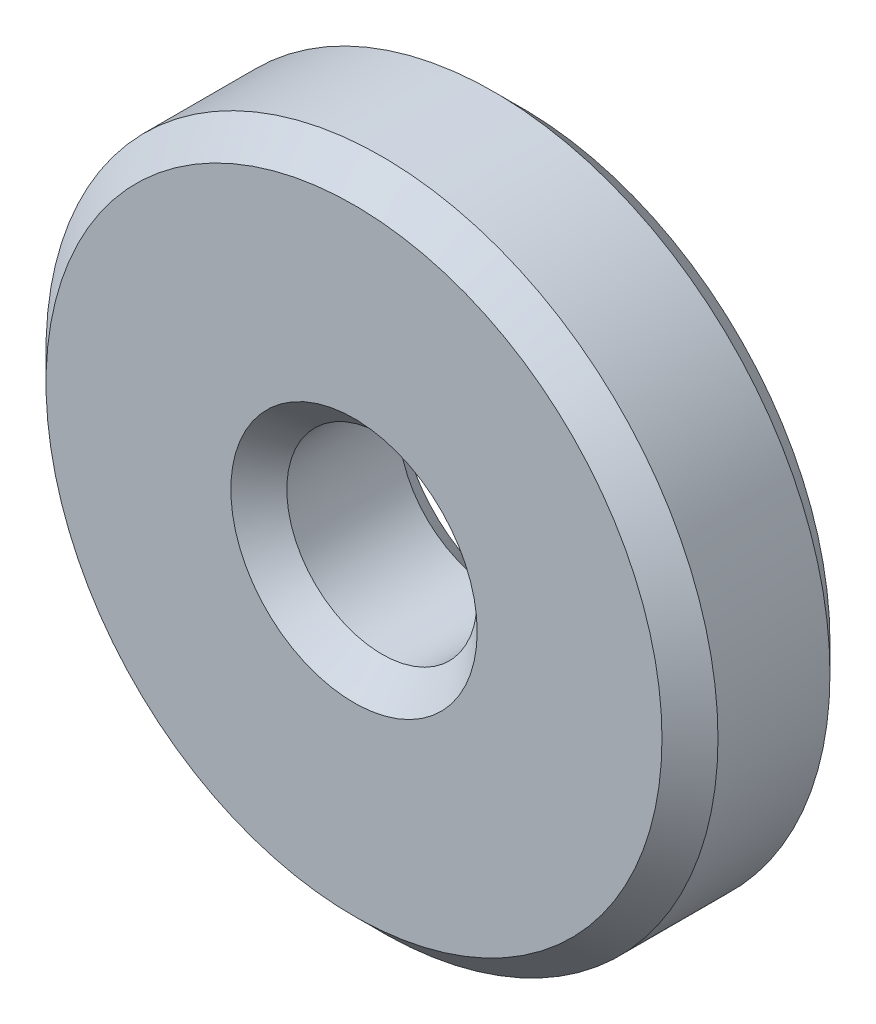
ISO-10303-21;
HEADER;
FILE_DESCRIPTION(('STEP AP214'),'2;1');
FILE_NAME('part.step','',(''),(''),'','','');
FILE_SCHEMA(('AUTOMOTIVE_DESIGN { 1 0 10303 214 1 1 1 1 }'));
ENDSEC;
DATA;
#1=APPLICATION_CONTEXT('core data for automotive mechanical design processes');
#2=APPLICATION_PROTOCOL_DEFINITION('international standard','automotive_design',2000,#1);
#3=PRODUCT_CONTEXT('',#1,'mechanical');
#4=PRODUCT('Part','Part','',(#3));
#5=PRODUCT_RELATED_PRODUCT_CATEGORY('part','',(#4));
#6=PRODUCT_DEFINITION_FORMATION('','',#4);
#7=PRODUCT_DEFINITION_CONTEXT('part definition',#1,'design');
#8=PRODUCT_DEFINITION('design','',#6,#7);
#9=PRODUCT_DEFINITION_SHAPE('','',#8);
#10=(LENGTH_UNIT() NAMED_UNIT(*) SI_UNIT(.MILLI.,.METRE.));
#11=(NAMED_UNIT(*) PLANE_ANGLE_UNIT() SI_UNIT($,.RADIAN.));
#12=(NAMED_UNIT(*) SI_UNIT($,.STERADIAN.) SOLID_ANGLE_UNIT());
#13=UNCERTAINTY_MEASURE_WITH_UNIT(LENGTH_MEASURE(1.E-05),#10,'distance_accuracy_value','');
#14=(GEOMETRIC_REPRESENTATION_CONTEXT(3) GLOBAL_UNCERTAINTY_ASSIGNED_CONTEXT((#13)) GLOBAL_UNIT_ASSIGNED_CONTEXT((#10,
#11,#12)) REPRESENTATION_CONTEXT('',''));
#15=CARTESIAN_POINT('',(0.,0.,0.));
#16=DIRECTION('',(0.,0.,1.));
#17=DIRECTION('',(1.,0.,0.));
#18=AXIS2_PLACEMENT_3D('',#15,#16,#17);
#19=CARTESIAN_POINT('',(0.,0.,3.));
#20=DIRECTION('',(0.,0.,1.));
#21=DIRECTION('',(1.,0.,0.));
#22=AXIS2_PLACEMENT_3D('',#19,#20,#21);
#23=PLANE('',#22);
#24=CARTESIAN_POINT('',(0.,0.,3.));
#25=DIRECTION('',(0.,0.,1.));
#26=DIRECTION('',(1.,0.,0.));
#27=AXIS2_PLACEMENT_3D('',#24,#25,#26);
#28=CIRCLE('',#27,2.2);
#29=CARTESIAN_POINT('',(2.2,0.,3.));
#30=VERTEX_POINT('',#29);
#31=EDGE_CURVE('E10',#30,#30,#28,.F.);
#32=ORIENTED_EDGE('',*,*,#31,.T.);
#33=EDGE_LOOP('',(#32));
#34=FACE_BOUND('',#33,.T.);
#35=CARTESIAN_POINT('',(0.,0.,3.));
#36=DIRECTION('',(0.,0.,1.));
#37=DIRECTION('',(1.,0.,0.));
#38=AXIS2_PLACEMENT_3D('',#35,#36,#37);
#39=CIRCLE('',#38,5.5);
#40=CARTESIAN_POINT('',(5.5,0.,3.));
#41=VERTEX_POINT('',#40);
#42=EDGE_CURVE('E37',#41,#41,#39,.T.);
#43=ORIENTED_EDGE('',*,*,#42,.T.);
#44=EDGE_LOOP('',(#43));
#45=FACE_BOUND('',#44,.T.);
#46=ADVANCED_FACE('F30',(#34,#45),#23,.T.);
#47=CARTESIAN_POINT('',(0.,0.,0.));
#48=DIRECTION('',(0.,0.,1.));
#49=DIRECTION('',(1.,0.,0.));
#50=AXIS2_PLACEMENT_3D('',#47,#48,#49);
#51=PLANE('',#50);
#52=CARTESIAN_POINT('',(0.,0.,0.));
#53=DIRECTION('',(0.,0.,1.));
#54=DIRECTION('',(1.,0.,0.));
#55=AXIS2_PLACEMENT_3D('',#52,#53,#54);
#56=CIRCLE('',#55,2.2);
#57=CARTESIAN_POINT('',(2.2,0.,0.));
#58=VERTEX_POINT('',#57);
#59=EDGE_CURVE('E56',#58,#58,#56,.T.);
#60=ORIENTED_EDGE('',*,*,#59,.T.);
#61=EDGE_LOOP('',(#60));
#62=FACE_BOUND('',#61,.T.);
#63=CARTESIAN_POINT('',(0.,0.,0.));
#64=DIRECTION('',(0.,0.,1.));
#65=DIRECTION('',(1.,0.,0.));
#66=AXIS2_PLACEMENT_3D('',#63,#64,#65);
#67=CIRCLE('',#66,5.5);
#68=CARTESIAN_POINT('',(5.5,0.,0.));
#69=VERTEX_POINT('',#68);
#70=EDGE_CURVE('E59',#69,#69,#67,.F.);
#71=ORIENTED_EDGE('',*,*,#70,.T.);
#72=EDGE_LOOP('',(#71));
#73=FACE_BOUND('',#72,.T.);
#74=ADVANCED_FACE('F63',(#62,#73),#51,.F.);
#75=CARTESIAN_POINT('',(0.,0.,3.));
#76=DIRECTION('',(0.,0.,-1.));
#77=DIRECTION('',(-1.,0.,0.));
#78=AXIS2_PLACEMENT_3D('',#75,#76,#77);
#79=CYLINDRICAL_SURFACE('',#78,6.);
#80=CARTESIAN_POINT('',(0.,0.,0.499999999999998));
#81=DIRECTION('',(0.,0.,1.));
#82=DIRECTION('',(1.,0.,0.));
#83=AXIS2_PLACEMENT_3D('',#80,#81,#82);
#84=CIRCLE('',#83,6.);
#85=CARTESIAN_POINT('',(6.,0.,0.499999999999998));
#86=VERTEX_POINT('',#85);
#87=EDGE_CURVE('E41',#86,#86,#84,.T.);
#88=ORIENTED_EDGE('',*,*,#87,.T.);
#89=EDGE_LOOP('',(#88));
#90=FACE_BOUND('',#89,.T.);
#91=CARTESIAN_POINT('',(0.,0.,2.5));
#92=DIRECTION('',(0.,0.,1.));
#93=DIRECTION('',(1.,0.,0.));
#94=AXIS2_PLACEMENT_3D('',#91,#92,#93);
#95=CIRCLE('',#94,6.);
#96=CARTESIAN_POINT('',(6.,0.,2.5));
#97=VERTEX_POINT('',#96);
#98=EDGE_CURVE('E45',#97,#97,#95,.F.);
#99=ORIENTED_EDGE('',*,*,#98,.T.);
#100=EDGE_LOOP('',(#99));
#101=FACE_BOUND('',#100,.T.);
#102=ADVANCED_FACE('F73',(#90,#101),#79,.T.);
#103=CARTESIAN_POINT('',(0.,0.,3.));
#104=DIRECTION('',(0.,0.,-1.));
#105=DIRECTION('',(-1.,0.,0.));
#106=AXIS2_PLACEMENT_3D('',#103,#104,#105);
#107=CYLINDRICAL_SURFACE('',#106,1.7);
#108=CARTESIAN_POINT('',(0.,0.,0.500000000000002));
#109=DIRECTION('',(0.,0.,1.));
#110=DIRECTION('',(1.,0.,0.));
#111=AXIS2_PLACEMENT_3D('',#108,#109,#110);
#112=CIRCLE('',#111,1.7);
#113=CARTESIAN_POINT('',(1.7,0.,0.500000000000002));
#114=VERTEX_POINT('',#113);
#115=EDGE_CURVE('E50',#114,#114,#112,.F.);
#116=ORIENTED_EDGE('',*,*,#115,.T.);
#117=EDGE_LOOP('',(#116));
#118=FACE_BOUND('',#117,.T.);
#119=CARTESIAN_POINT('',(0.,0.,2.5));
#120=DIRECTION('',(0.,0.,1.));
#121=DIRECTION('',(1.,0.,0.));
#122=AXIS2_PLACEMENT_3D('',#119,#120,#121);
#123=CIRCLE('',#122,1.7);
#124=CARTESIAN_POINT('',(1.7,0.,2.5));
#125=VERTEX_POINT('',#124);
#126=EDGE_CURVE('E53',#125,#125,#123,.T.);
#127=ORIENTED_EDGE('',*,*,#126,.T.);
#128=EDGE_LOOP('',(#127));
#129=FACE_BOUND('',#128,.T.);
#130=ADVANCED_FACE('F76',(#118,#129),#107,.F.);
#131=CARTESIAN_POINT('',(0.,0.,0.));
#132=DIRECTION('',(0.,0.,-1.));
#133=DIRECTION('',(-1.,0.,0.));
#134=AXIS2_PLACEMENT_3D('',#131,#132,#133);
#135=CONICAL_SURFACE('',#134,2.2,0.785398163397446);
#136=ORIENTED_EDGE('',*,*,#115,.F.);
#137=EDGE_LOOP('',(#136));
#138=FACE_BOUND('',#137,.T.);
#139=ORIENTED_EDGE('',*,*,#59,.F.);
#140=EDGE_LOOP('',(#139));
#141=FACE_BOUND('',#140,.T.);
#142=ADVANCED_FACE('F69',(#138,#141),#135,.F.);
#143=CARTESIAN_POINT('',(0.,0.,0.499999999999998));
#144=DIRECTION('',(0.,0.,1.));
#145=DIRECTION('',(1.,0.,0.));
#146=AXIS2_PLACEMENT_3D('',#143,#144,#145);
#147=CONICAL_SURFACE('',#146,6.,0.785398163397451);
#148=ORIENTED_EDGE('',*,*,#70,.F.);
#149=EDGE_LOOP('',(#148));
#150=FACE_BOUND('',#149,.T.);
#151=ORIENTED_EDGE('',*,*,#87,.F.);
#152=EDGE_LOOP('',(#151));
#153=FACE_BOUND('',#152,.T.);
#154=ADVANCED_FACE('F65',(#150,#153),#147,.T.);
#155=CARTESIAN_POINT('',(0.,0.,2.5));
#156=DIRECTION('',(0.,0.,1.));
#157=DIRECTION('',(1.,0.,0.));
#158=AXIS2_PLACEMENT_3D('',#155,#156,#157);
#159=CONICAL_SURFACE('',#158,1.7,0.785398163397451);
#160=ORIENTED_EDGE('',*,*,#31,.F.);
#161=EDGE_LOOP('',(#160));
#162=FACE_BOUND('',#161,.T.);
#163=ORIENTED_EDGE('',*,*,#126,.F.);
#164=EDGE_LOOP('',(#163));
#165=FACE_BOUND('',#164,.T.);
#166=ADVANCED_FACE('F68',(#162,#165),#159,.F.);
#167=CARTESIAN_POINT('',(0.,0.,3.));
#168=DIRECTION('',(0.,0.,-1.));
#169=DIRECTION('',(-1.,0.,0.));
#170=AXIS2_PLACEMENT_3D('',#167,#168,#169);
#171=CONICAL_SURFACE('',#170,5.5,0.785398163397447);
#172=ORIENTED_EDGE('',*,*,#98,.F.);
#173=EDGE_LOOP('',(#172));
#174=FACE_BOUND('',#173,.T.);
#175=ORIENTED_EDGE('',*,*,#42,.F.);
#176=EDGE_LOOP('',(#175));
#177=FACE_BOUND('',#176,.T.);
#178=ADVANCED_FACE('F32',(#174,#177),#171,.T.);
#179=CLOSED_SHELL('',(#46,#74,#102,#130,#142,#154,#166,#178));
#180=MANIFOLD_SOLID_BREP('B2',#179);
#181=ADVANCED_BREP_SHAPE_REPRESENTATION('',(#18,#180),#14);
#182=SHAPE_DEFINITION_REPRESENTATION(#9,#181);
ENDSEC;
END-ISO-10303-21;
